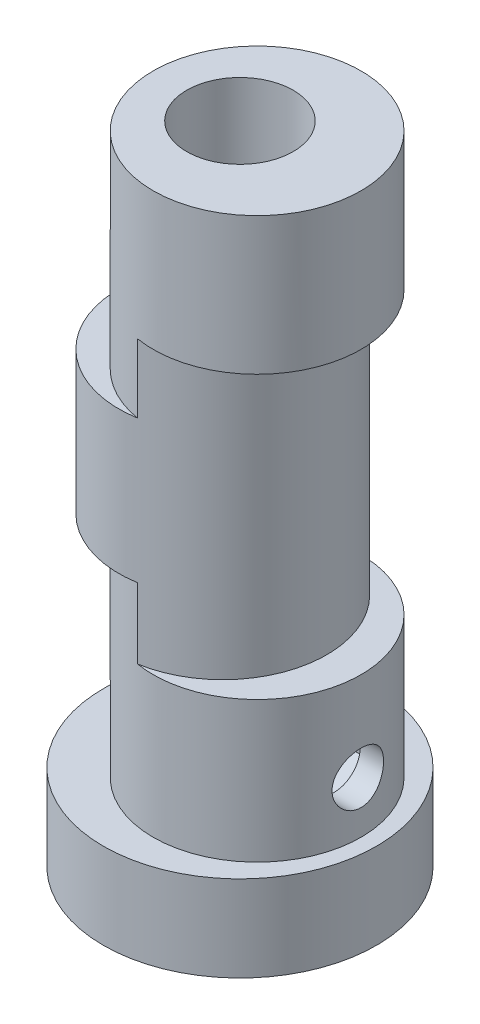
ISO-10303-21;
HEADER;
FILE_DESCRIPTION(('STEP AP214'),'2;1');
FILE_NAME('part.step','',(''),(''),'','','');
FILE_SCHEMA(('AUTOMOTIVE_DESIGN { 1 0 10303 214 1 1 1 1 }'));
ENDSEC;
DATA;
#1=APPLICATION_CONTEXT('core data for automotive mechanical design processes');
#2=APPLICATION_PROTOCOL_DEFINITION('international standard','automotive_design',2000,#1);
#3=PRODUCT_CONTEXT('',#1,'mechanical');
#4=PRODUCT('Part','Part','',(#3));
#5=PRODUCT_RELATED_PRODUCT_CATEGORY('part','',(#4));
#6=PRODUCT_DEFINITION_FORMATION('','',#4);
#7=PRODUCT_DEFINITION_CONTEXT('part definition',#1,'design');
#8=PRODUCT_DEFINITION('design','',#6,#7);
#9=PRODUCT_DEFINITION_SHAPE('','',#8);
#10=(LENGTH_UNIT() NAMED_UNIT(*) SI_UNIT(.MILLI.,.METRE.));
#11=(NAMED_UNIT(*) PLANE_ANGLE_UNIT() SI_UNIT($,.RADIAN.));
#12=(NAMED_UNIT(*) SI_UNIT($,.STERADIAN.) SOLID_ANGLE_UNIT());
#13=UNCERTAINTY_MEASURE_WITH_UNIT(LENGTH_MEASURE(1.E-05),#10,'distance_accuracy_value','');
#14=(GEOMETRIC_REPRESENTATION_CONTEXT(3) GLOBAL_UNCERTAINTY_ASSIGNED_CONTEXT((#13)) GLOBAL_UNIT_ASSIGNED_CONTEXT((#10,
#11,#12)) REPRESENTATION_CONTEXT('',''));
#15=CARTESIAN_POINT('',(0.,0.,0.));
#16=DIRECTION('',(0.,0.,1.));
#17=DIRECTION('',(1.,0.,0.));
#18=AXIS2_PLACEMENT_3D('',#15,#16,#17);
#19=CARTESIAN_POINT('',(0.,37.6,0.));
#20=DIRECTION('',(0.,-1.,0.));
#21=DIRECTION('',(0.,0.,-1.));
#22=AXIS2_PLACEMENT_3D('',#19,#20,#21);
#23=CYLINDRICAL_SURFACE('',#22,3.1);
#24=CARTESIAN_POINT('',(0.,0.,0.));
#25=DIRECTION('',(0.,-1.,0.));
#26=DIRECTION('',(0.,0.,-1.));
#27=AXIS2_PLACEMENT_3D('',#24,#25,#26);
#28=CIRCLE('',#27,3.1);
#29=CARTESIAN_POINT('',(0.,0.,-3.1));
#30=VERTEX_POINT('',#29);
#31=EDGE_CURVE('E141',#30,#30,#28,.T.);
#32=ORIENTED_EDGE('',*,*,#31,.T.);
#33=EDGE_LOOP('',(#32));
#34=FACE_BOUND('',#33,.T.);
#35=CARTESIAN_POINT('',(0.,37.6,0.));
#36=DIRECTION('',(0.,-1.,0.));
#37=DIRECTION('',(0.,0.,-1.));
#38=AXIS2_PLACEMENT_3D('',#35,#36,#37);
#39=CIRCLE('',#38,3.1);
#40=CARTESIAN_POINT('',(0.,37.6,-3.1));
#41=VERTEX_POINT('',#40);
#42=EDGE_CURVE('E152',#41,#41,#39,.T.);
#43=ORIENTED_EDGE('',*,*,#42,.F.);
#44=EDGE_LOOP('',(#43));
#45=FACE_BOUND('',#44,.T.);
#46=CARTESIAN_POINT('',(0.,11.1754264805429,0.));
#47=DIRECTION('',(0.,-0.866025403784439,0.5));
#48=DIRECTION('',(0.,-0.5,-0.866025403784439));
#49=AXIS2_PLACEMENT_3D('',#46,#47,#48);
#50=ELLIPSE('',#49,3.57957166897568,3.1);
#51=CARTESIAN_POINT('',(3.1,11.1754264805429,0.));
#52=VERTEX_POINT('',#51);
#53=CARTESIAN_POINT('',(1.43090880212542,9.58771324027147,-2.75));
#54=VERTEX_POINT('',#53);
#55=EDGE_CURVE('E11',#52,#54,#50,.F.);
#56=ORIENTED_EDGE('',*,*,#55,.F.);
#57=CARTESIAN_POINT('',(0.,11.1754264805429,0.));
#58=DIRECTION('',(0.,-0.866025403784438,-0.5));
#59=DIRECTION('',(0.,-0.5,0.866025403784439));
#60=AXIS2_PLACEMENT_3D('',#57,#58,#59);
#61=ELLIPSE('',#60,3.57957166897568,3.1);
#62=CARTESIAN_POINT('',(1.43090880212543,9.58771324027147,2.75));
#63=VERTEX_POINT('',#62);
#64=EDGE_CURVE('E47',#63,#52,#61,.F.);
#65=ORIENTED_EDGE('',*,*,#64,.F.);
#66=DIRECTION('',(0.,-1.,0.));
#67=VECTOR('',#66,1.);
#68=CARTESIAN_POINT('',(1.43090880212543,37.6,2.75));
#69=LINE('',#68,#67);
#70=CARTESIAN_POINT('',(1.43090880212542,6.41228675972853,2.75));
#71=VERTEX_POINT('',#70);
#72=EDGE_CURVE('E233',#71,#63,#69,.F.);
#73=ORIENTED_EDGE('',*,*,#72,.F.);
#74=CARTESIAN_POINT('',(0.,4.82457351945705,0.));
#75=DIRECTION('',(0.,0.866025403784438,-0.5));
#76=DIRECTION('',(0.,-0.5,-0.866025403784439));
#77=AXIS2_PLACEMENT_3D('',#74,#75,#76);
#78=ELLIPSE('',#77,3.57957166897568,3.1);
#79=CARTESIAN_POINT('',(3.1,4.82457351945706,0.));
#80=VERTEX_POINT('',#79);
#81=EDGE_CURVE('E231',#80,#71,#78,.F.);
#82=ORIENTED_EDGE('',*,*,#81,.F.);
#83=CARTESIAN_POINT('',(0.,4.82457351945707,0.));
#84=DIRECTION('',(0.,0.866025403784438,0.500000000000001));
#85=DIRECTION('',(0.,-0.500000000000001,0.866025403784438));
#86=AXIS2_PLACEMENT_3D('',#83,#84,#85);
#87=ELLIPSE('',#86,3.57957166897568,3.1);
#88=CARTESIAN_POINT('',(1.43090880212542,6.41228675972853,-2.75));
#89=VERTEX_POINT('',#88);
#90=EDGE_CURVE('E229',#89,#80,#87,.F.);
#91=ORIENTED_EDGE('',*,*,#90,.F.);
#92=DIRECTION('',(0.,-1.,0.));
#93=VECTOR('',#92,1.);
#94=CARTESIAN_POINT('',(1.43090880212542,37.6,-2.75));
#95=LINE('',#94,#93);
#96=EDGE_CURVE('E225',#54,#89,#95,.T.);
#97=ORIENTED_EDGE('',*,*,#96,.F.);
#98=EDGE_LOOP('',(#56,#65,#73,#82,#91,#97));
#99=FACE_BOUND('',#98,.T.);
#100=ADVANCED_FACE('F39',(#34,#45,#99),#23,.F.);
#101=CARTESIAN_POINT('',(1.,13.2,0.));
#102=DIRECTION('',(0.,-1.,0.));
#103=DIRECTION('',(0.,0.,-1.));
#104=AXIS2_PLACEMENT_3D('',#101,#102,#103);
#105=CYLINDRICAL_SURFACE('',#104,6.05);
#106=CARTESIAN_POINT('',(1.,13.2,0.));
#107=DIRECTION('',(0.,1.,0.));
#108=DIRECTION('',(0.,0.,1.));
#109=AXIS2_PLACEMENT_3D('',#106,#107,#108);
#110=CIRCLE('',#109,6.05);
#111=CARTESIAN_POINT('',(0.,13.2,5.96678305286861));
#112=VERTEX_POINT('',#111);
#113=CARTESIAN_POINT('',(0.,13.2,-5.96678305286861));
#114=VERTEX_POINT('',#113);
#115=EDGE_CURVE('E204',#112,#114,#110,.T.);
#116=ORIENTED_EDGE('',*,*,#115,.F.);
#117=DIRECTION('',(0.,-1.,0.));
#118=VECTOR('',#117,1.);
#119=CARTESIAN_POINT('',(0.,17.3,5.96678305286861));
#120=LINE('',#119,#118);
#121=CARTESIAN_POINT('',(0.,17.3,5.96678305286861));
#122=VERTEX_POINT('',#121);
#123=EDGE_CURVE('E212',#122,#112,#120,.T.);
#124=ORIENTED_EDGE('',*,*,#123,.F.);
#125=CARTESIAN_POINT('',(1.,17.3,0.));
#126=DIRECTION('',(0.,1.,0.));
#127=DIRECTION('',(0.,0.,-1.));
#128=AXIS2_PLACEMENT_3D('',#125,#126,#127);
#129=CIRCLE('',#128,6.05);
#130=CARTESIAN_POINT('',(0.,17.3,-5.96678305286861));
#131=VERTEX_POINT('',#130);
#132=EDGE_CURVE('E60',#131,#122,#129,.T.);
#133=ORIENTED_EDGE('',*,*,#132,.F.);
#134=DIRECTION('',(0.,-1.,0.));
#135=VECTOR('',#134,1.);
#136=CARTESIAN_POINT('',(0.,17.3,-5.96678305286861));
#137=LINE('',#136,#135);
#138=EDGE_CURVE('E208',#131,#114,#137,.T.);
#139=ORIENTED_EDGE('',*,*,#138,.T.);
#140=EDGE_LOOP('',(#116,#124,#133,#139));
#141=FACE_BOUND('',#140,.T.);
#142=CARTESIAN_POINT('',(1.,5.,0.));
#143=DIRECTION('',(0.,1.,0.));
#144=DIRECTION('',(0.,0.,1.));
#145=AXIS2_PLACEMENT_3D('',#142,#143,#144);
#146=CIRCLE('',#145,6.05);
#147=CARTESIAN_POINT('',(1.,5.,6.05));
#148=VERTEX_POINT('',#147);
#149=EDGE_CURVE('E222',#148,#148,#146,.T.);
#150=ORIENTED_EDGE('',*,*,#149,.T.);
#151=EDGE_LOOP('',(#150));
#152=FACE_BOUND('',#151,.T.);
#153=CARTESIAN_POINT('',(6.86110057924278,8.,1.5));
#154=CARTESIAN_POINT('',(6.86110217367536,7.91714587137172,1.49999760729791));
#155=CARTESIAN_POINT('',(6.86287663428657,7.83426511613971,1.49311181217705));
#156=CARTESIAN_POINT('',(6.86976498249834,7.670882052661,1.46579350632765));
#157=CARTESIAN_POINT('',(6.87488084608938,7.59038118125792,1.445352979689));
#158=CARTESIAN_POINT('',(6.88783778656131,7.43414476654856,1.39162611516137));
#159=CARTESIAN_POINT('',(6.8956753813872,7.35840327982597,1.35835618463151));
#160=CARTESIAN_POINT('',(6.91318836160376,7.21356909431857,1.27996470184059));
#161=CARTESIAN_POINT('',(6.92286381710868,7.14447664934581,1.23484269739853));
#162=CARTESIAN_POINT('',(6.94319677296986,7.01340615943171,1.13298474675015));
#163=CARTESIAN_POINT('',(6.95386975225715,6.95159324991117,1.07603935351548));
#164=CARTESIAN_POINT('',(6.97486081852894,6.83829068297635,0.952602302875023));
#165=CARTESIAN_POINT('',(6.98517887267731,6.78680197859623,0.886109765137409));
#166=CARTESIAN_POINT('',(7.00446859697605,6.69493532862109,0.744336271648474));
#167=CARTESIAN_POINT('',(7.01341987085189,6.65471937361786,0.668947333761871));
#168=CARTESIAN_POINT('',(7.02879099894912,6.58759271270261,0.512220466156249));
#169=CARTESIAN_POINT('',(7.03521122030227,6.56068007698666,0.430883401249684));
#170=CARTESIAN_POINT('',(7.04468743585777,6.52145227668836,0.266290396119425));
#171=CARTESIAN_POINT('',(7.04780795818022,6.50885674721242,0.183105055079771));
#172=CARTESIAN_POINT('',(7.0505579516296,6.49774089309785,0.0157474370432213));
#173=CARTESIAN_POINT('',(7.05018793073681,6.49921852038692,-0.0684246945649362));
#174=CARTESIAN_POINT('',(7.04604665321057,6.51600488970314,-0.233422888586485));
#175=CARTESIAN_POINT('',(7.04234981165999,6.53101103591603,-0.314281884537095));
#176=CARTESIAN_POINT('',(7.0320567873074,6.57394238136332,-0.472296327731109));
#177=CARTESIAN_POINT('',(7.02546045160435,6.60186826190719,-0.549451579424341));
#178=CARTESIAN_POINT('',(7.00999536208592,6.67009276335159,-0.698668567709344));
#179=CARTESIAN_POINT('',(7.00110685770729,6.71049955711579,-0.770678714844493));
#180=CARTESIAN_POINT('',(6.98202234290113,6.80245692985698,-0.907002591352019));
#181=CARTESIAN_POINT('',(6.97182610847385,6.85400941900861,-0.971314998529292));
#182=CARTESIAN_POINT('',(6.95091759023657,6.96841873937155,-1.09222215921076));
#183=CARTESIAN_POINT('',(6.94019879471365,7.03154003122689,-1.14856580377562));
#184=CARTESIAN_POINT('',(6.91970208093319,7.16644754447298,-1.24992355886011));
#185=CARTESIAN_POINT('',(6.90992420519092,7.23823415707433,-1.29493715758235));
#186=CARTESIAN_POINT('',(6.89239348689465,7.38892100880766,-1.37251428556563));
#187=CARTESIAN_POINT('',(6.88465038180007,7.46785310780654,-1.4050182819803));
#188=CARTESIAN_POINT('',(6.87219140120225,7.63029951371645,-1.45621769350445));
#189=CARTESIAN_POINT('',(6.86747488999598,7.71381285438491,-1.47491600847108));
#190=CARTESIAN_POINT('',(6.86173629027501,7.88072474513991,-1.49755857016642));
#191=CARTESIAN_POINT('',(6.86062135564323,7.96406984990241,-1.50187370065171));
#192=CARTESIAN_POINT('',(6.86195957531532,8.13028931028266,-1.49664199033746));
#193=CARTESIAN_POINT('',(6.86441240716819,8.21316370776287,-1.48709640225529));
#194=CARTESIAN_POINT('',(6.87252090694453,8.3747181302517,-1.45473918826511));
#195=CARTESIAN_POINT('',(6.87812460220794,8.45344409600041,-1.43214267357483));
#196=CARTESIAN_POINT('',(6.89185426126893,8.6059908666113,-1.37456314650524));
#197=CARTESIAN_POINT('',(6.89998052003537,8.67981109660887,-1.33957868550896));
#198=CARTESIAN_POINT('',(6.9180357563623,8.8220247131691,-1.25743723368045));
#199=CARTESIAN_POINT('',(6.92799654258515,8.89028562447971,-1.21005803083144));
#200=CARTESIAN_POINT('',(6.94852006867982,9.01802431333303,-1.10475366386703));
#201=CARTESIAN_POINT('',(6.95908290558408,9.07750066949077,-1.04682679646502));
#202=CARTESIAN_POINT('',(6.97993443343643,9.18747991415488,-0.920370957671625));
#203=CARTESIAN_POINT('',(6.99021001670874,9.23772649030761,-0.851616508272099));
#204=CARTESIAN_POINT('',(7.00906038437325,9.32596033846671,-0.706430295944581));
#205=CARTESIAN_POINT('',(7.01763525706996,9.36394824703339,-0.629998931928885));
#206=CARTESIAN_POINT('',(7.03206425372718,9.42625932271639,-0.472154470432044));
#207=CARTESIAN_POINT('',(7.03793777127095,9.45068016287485,-0.39078178696266));
#208=CARTESIAN_POINT('',(7.04638710617045,9.48545807315556,-0.224922898812481));
#209=CARTESIAN_POINT('',(7.04896354877285,9.49581780980274,-0.14043728758455));
#210=CARTESIAN_POINT('',(7.05050340142597,9.50203151440792,0.0268395993869947));
#211=CARTESIAN_POINT('',(7.0495611020357,9.49826403330175,0.109616160271725));
#212=CARTESIAN_POINT('',(7.04437794752261,9.47719588648497,0.273317601317939));
#213=CARTESIAN_POINT('',(7.04013718756209,9.45989561120246,0.354242534830506));
#214=CARTESIAN_POINT('',(7.02884767516888,9.41245458975646,0.511554490385019));
#215=CARTESIAN_POINT('',(7.02181368205091,9.3823812785264,0.587962977172823));
#216=CARTESIAN_POINT('',(7.00567908247639,9.31030923435466,0.734692610041684));
#217=CARTESIAN_POINT('',(6.99657821932499,9.26830901998936,0.805012998512026));
#218=CARTESIAN_POINT('',(6.97702334081307,9.17241531369771,0.93936896622043));
#219=CARTESIAN_POINT('',(6.96654243871359,9.11826430572933,1.00321683816191));
#220=CARTESIAN_POINT('',(6.94553123285239,9.0001075108588,1.1210479399132));
#221=CARTESIAN_POINT('',(6.9350009172867,8.93609923946367,1.17502867521914));
#222=CARTESIAN_POINT('',(6.91486446643399,8.79863730685887,1.27256022779907));
#223=CARTESIAN_POINT('',(6.90527872854423,8.72503245648526,1.31590249407604));
#224=CARTESIAN_POINT('',(6.8883898493467,8.57135425832718,1.38953305297952));
#225=CARTESIAN_POINT('',(6.88108502882819,8.49128572402066,1.41983095511834));
#226=CARTESIAN_POINT('',(6.87074164327452,8.34278419005039,1.46193818009331));
#227=CARTESIAN_POINT('',(6.8671532176125,8.27506913437123,1.47618052311146));
#228=CARTESIAN_POINT('',(6.86233211731693,8.13824215433896,1.49521204246427));
#229=CARTESIAN_POINT('',(6.86109924890864,8.06913034535939,1.50000199637996));
#230=CARTESIAN_POINT('',(6.86110057924278,8.,1.5));
#231=B_SPLINE_CURVE_WITH_KNOTS('',3,(#153,#154,#155,#156,#157,#158,#159,#160,#161,#162,#163,
#164,#165,#166,#167,#168,#169,#170,#171,#172,#173,#174,#175,#176,#177,#178,#179,#180,#181,#182,
#183,#184,#185,#186,#187,#188,#189,#190,#191,#192,#193,#194,#195,#196,#197,#198,#199,#200,#201,
#202,#203,#204,#205,#206,#207,#208,#209,#210,#211,#212,#213,#214,#215,#216,#217,#218,#219,#220,
#221,#222,#223,#224,#225,#226,#227,#228,#229,#230),.UNSPECIFIED.,.T.,.F.,(4,2,2,2,2,2,2,2,2,2,2,
2,2,2,2,2,2,2,2,2,2,2,2,2,2,2,2,2,2,2,2,2,2,2,2,2,2,2,4),(0.,0.248308555378158,
0.496764084985492,0.744902916216995,0.993051215830473,1.24604175182045,1.49905563079248,
1.7555380079994,2.01198316847503,2.2633149664209,2.51461018850564,2.76042038788378,
3.0062435512986,3.25426007800209,3.5023191440844,3.75698358308596,4.01165952364873,
4.26753289950162,4.52335251433644,4.77252234046925,5.02166964829331,5.26682305522691,
5.51200513928917,5.76192634197362,6.01188793896216,6.26798960627748,6.52407797276705,
6.77829797232379,7.0324697552718,7.27988006564556,7.52728323836719,7.77339617740614,
8.01953969916322,8.27149784954299,8.52351960945305,8.78014536003377,9.03658173491864,
9.24377802972128,9.45095727924299),.UNSPECIFIED.);
#232=CARTESIAN_POINT('',(6.86110057924278,8.,1.5));
#233=VERTEX_POINT('',#232);
#234=EDGE_CURVE('E137',#233,#233,#231,.T.);
#235=ORIENTED_EDGE('',*,*,#234,.F.);
#236=EDGE_LOOP('',(#235));
#237=FACE_BOUND('',#236,.T.);
#238=ADVANCED_FACE('F154',(#141,#152,#237),#105,.T.);
#239=CARTESIAN_POINT('',(0.,5.,0.));
#240=DIRECTION('',(0.,-1.,0.));
#241=DIRECTION('',(0.,0.,-1.));
#242=AXIS2_PLACEMENT_3D('',#239,#240,#241);
#243=CYLINDRICAL_SURFACE('',#242,7.95);
#244=CARTESIAN_POINT('',(0.,5.,0.));
#245=DIRECTION('',(0.,1.,0.));
#246=DIRECTION('',(0.,0.,1.));
#247=AXIS2_PLACEMENT_3D('',#244,#245,#246);
#248=CIRCLE('',#247,7.95);
#249=CARTESIAN_POINT('',(0.,5.,7.95));
#250=VERTEX_POINT('',#249);
#251=EDGE_CURVE('E217',#250,#250,#248,.T.);
#252=ORIENTED_EDGE('',*,*,#251,.F.);
#253=EDGE_LOOP('',(#252));
#254=FACE_BOUND('',#253,.T.);
#255=CARTESIAN_POINT('',(0.,0.,0.));
#256=DIRECTION('',(0.,1.,0.));
#257=DIRECTION('',(0.,0.,1.));
#258=AXIS2_PLACEMENT_3D('',#255,#256,#257);
#259=CIRCLE('',#258,7.95);
#260=CARTESIAN_POINT('',(0.,0.,7.95));
#261=VERTEX_POINT('',#260);
#262=EDGE_CURVE('E214',#261,#261,#259,.T.);
#263=ORIENTED_EDGE('',*,*,#262,.T.);
#264=EDGE_LOOP('',(#263));
#265=FACE_BOUND('',#264,.T.);
#266=ADVANCED_FACE('F41',(#254,#265),#243,.T.);
#267=CARTESIAN_POINT('',(0.,5.,0.));
#268=DIRECTION('',(0.,1.,0.));
#269=DIRECTION('',(0.,0.,1.));
#270=AXIS2_PLACEMENT_3D('',#267,#268,#269);
#271=PLANE('',#270);
#272=ORIENTED_EDGE('',*,*,#149,.F.);
#273=EDGE_LOOP('',(#272));
#274=FACE_BOUND('',#273,.T.);
#275=ORIENTED_EDGE('',*,*,#251,.T.);
#276=EDGE_LOOP('',(#275));
#277=FACE_BOUND('',#276,.T.);
#278=ADVANCED_FACE('F197',(#274,#277),#271,.T.);
#279=CARTESIAN_POINT('',(0.,0.,0.));
#280=DIRECTION('',(0.,1.,0.));
#281=DIRECTION('',(0.,0.,1.));
#282=AXIS2_PLACEMENT_3D('',#279,#280,#281);
#283=PLANE('',#282);
#284=ORIENTED_EDGE('',*,*,#31,.F.);
#285=EDGE_LOOP('',(#284));
#286=FACE_BOUND('',#285,.T.);
#287=ORIENTED_EDGE('',*,*,#262,.F.);
#288=EDGE_LOOP('',(#287));
#289=FACE_BOUND('',#288,.T.);
#290=ADVANCED_FACE('F192',(#286,#289),#283,.F.);
#291=CARTESIAN_POINT('',(1.,13.2,0.));
#292=DIRECTION('',(0.,1.,0.));
#293=DIRECTION('',(0.,0.,1.));
#294=AXIS2_PLACEMENT_3D('',#291,#292,#293);
#295=PLANE('',#294);
#296=CARTESIAN_POINT('',(-1.,13.2,0.));
#297=DIRECTION('',(0.,1.,0.));
#298=DIRECTION('',(0.,0.,1.));
#299=AXIS2_PLACEMENT_3D('',#296,#297,#298);
#300=CIRCLE('',#299,6.05);
#301=EDGE_CURVE('E202',#112,#114,#300,.T.);
#302=ORIENTED_EDGE('',*,*,#301,.F.);
#303=ORIENTED_EDGE('',*,*,#115,.T.);
#304=EDGE_LOOP('',(#302,#303));
#305=FACE_BOUND('',#304,.T.);
#306=ADVANCED_FACE('F189',(#305),#295,.T.);
#307=CARTESIAN_POINT('',(-1.,29.6,0.));
#308=DIRECTION('',(0.,-1.,0.));
#309=DIRECTION('',(0.,0.,-1.));
#310=AXIS2_PLACEMENT_3D('',#307,#308,#309);
#311=CYLINDRICAL_SURFACE('',#310,6.05);
#312=CARTESIAN_POINT('',(-1.,29.6,0.));
#313=DIRECTION('',(0.,1.,0.));
#314=DIRECTION('',(0.,0.,1.));
#315=AXIS2_PLACEMENT_3D('',#312,#313,#314);
#316=CIRCLE('',#315,6.05);
#317=CARTESIAN_POINT('',(0.,29.6,5.96678305286861));
#318=VERTEX_POINT('',#317);
#319=CARTESIAN_POINT('',(0.,29.6,-5.96678305286861));
#320=VERTEX_POINT('',#319);
#321=EDGE_CURVE('E207',#318,#320,#316,.T.);
#322=ORIENTED_EDGE('',*,*,#321,.F.);
#323=DIRECTION('',(0.,1.,0.));
#324=VECTOR('',#323,1.);
#325=CARTESIAN_POINT('',(0.,25.6,5.9667830528686));
#326=LINE('',#325,#324);
#327=CARTESIAN_POINT('',(0.,25.6,5.9667830528686));
#328=VERTEX_POINT('',#327);
#329=EDGE_CURVE('E437',#328,#318,#326,.T.);
#330=ORIENTED_EDGE('',*,*,#329,.F.);
#331=CARTESIAN_POINT('',(-1.,25.6,0.));
#332=DIRECTION('',(0.,1.,0.));
#333=DIRECTION('',(0.,0.,1.));
#334=AXIS2_PLACEMENT_3D('',#331,#332,#333);
#335=CIRCLE('',#334,6.05);
#336=CARTESIAN_POINT('',(0.,25.6,-5.96678305286861));
#337=VERTEX_POINT('',#336);
#338=EDGE_CURVE('E443',#337,#328,#335,.T.);
#339=ORIENTED_EDGE('',*,*,#338,.F.);
#340=DIRECTION('',(0.,1.,0.));
#341=VECTOR('',#340,1.);
#342=CARTESIAN_POINT('',(0.,25.6,-5.96678305286861));
#343=LINE('',#342,#341);
#344=EDGE_CURVE('E434',#337,#320,#343,.T.);
#345=ORIENTED_EDGE('',*,*,#344,.T.);
#346=EDGE_LOOP('',(#322,#330,#339,#345));
#347=FACE_BOUND('',#346,.T.);
#348=CARTESIAN_POINT('',(-1.,17.3,0.));
#349=DIRECTION('',(0.,-1.,0.));
#350=DIRECTION('',(0.,0.,-1.));
#351=AXIS2_PLACEMENT_3D('',#348,#349,#350);
#352=CIRCLE('',#351,6.05);
#353=EDGE_CURVE('E426',#122,#131,#352,.T.);
#354=ORIENTED_EDGE('',*,*,#353,.F.);
#355=ORIENTED_EDGE('',*,*,#123,.T.);
#356=ORIENTED_EDGE('',*,*,#301,.T.);
#357=ORIENTED_EDGE('',*,*,#138,.F.);
#358=EDGE_LOOP('',(#354,#355,#356,#357));
#359=FACE_BOUND('',#358,.T.);
#360=ADVANCED_FACE('F187',(#347,#359),#311,.T.);
#361=CARTESIAN_POINT('',(0.,17.3,0.));
#362=DIRECTION('',(0.,-1.,0.));
#363=DIRECTION('',(0.,0.,-1.));
#364=AXIS2_PLACEMENT_3D('',#361,#362,#363);
#365=PLANE('',#364);
#366=ORIENTED_EDGE('',*,*,#132,.T.);
#367=ORIENTED_EDGE('',*,*,#353,.T.);
#368=EDGE_LOOP('',(#366,#367));
#369=FACE_BOUND('',#368,.T.);
#370=ADVANCED_FACE('F180',(#369),#365,.T.);
#371=CARTESIAN_POINT('',(0.,29.6,0.));
#372=DIRECTION('',(0.,1.,0.));
#373=DIRECTION('',(0.,0.,1.));
#374=AXIS2_PLACEMENT_3D('',#371,#372,#373);
#375=PLANE('',#374);
#376=CARTESIAN_POINT('',(1.,29.6,0.));
#377=DIRECTION('',(0.,1.,0.));
#378=DIRECTION('',(0.,0.,1.));
#379=AXIS2_PLACEMENT_3D('',#376,#377,#378);
#380=CIRCLE('',#379,6.05);
#381=EDGE_CURVE('E431',#318,#320,#380,.T.);
#382=ORIENTED_EDGE('',*,*,#381,.F.);
#383=ORIENTED_EDGE('',*,*,#321,.T.);
#384=EDGE_LOOP('',(#382,#383));
#385=FACE_BOUND('',#384,.T.);
#386=ADVANCED_FACE('F177',(#385),#375,.F.);
#387=CARTESIAN_POINT('',(1.,37.6,0.));
#388=DIRECTION('',(0.,-1.,0.));
#389=DIRECTION('',(0.,0.,-1.));
#390=AXIS2_PLACEMENT_3D('',#387,#388,#389);
#391=CYLINDRICAL_SURFACE('',#390,6.05);
#392=CARTESIAN_POINT('',(1.,37.6,0.));
#393=DIRECTION('',(0.,1.,0.));
#394=DIRECTION('',(0.,0.,1.));
#395=AXIS2_PLACEMENT_3D('',#392,#393,#394);
#396=CIRCLE('',#395,6.05);
#397=CARTESIAN_POINT('',(1.,37.6,6.05));
#398=VERTEX_POINT('',#397);
#399=EDGE_CURVE('E430',#398,#398,#396,.T.);
#400=ORIENTED_EDGE('',*,*,#399,.F.);
#401=EDGE_LOOP('',(#400));
#402=FACE_BOUND('',#401,.T.);
#403=ORIENTED_EDGE('',*,*,#381,.T.);
#404=ORIENTED_EDGE('',*,*,#344,.F.);
#405=CARTESIAN_POINT('',(1.,25.6,0.));
#406=DIRECTION('',(0.,-1.,0.));
#407=DIRECTION('',(0.,0.,1.));
#408=AXIS2_PLACEMENT_3D('',#405,#406,#407);
#409=CIRCLE('',#408,6.05);
#410=EDGE_CURVE('E439',#328,#337,#409,.T.);
#411=ORIENTED_EDGE('',*,*,#410,.F.);
#412=ORIENTED_EDGE('',*,*,#329,.T.);
#413=EDGE_LOOP('',(#403,#404,#411,#412));
#414=FACE_BOUND('',#413,.T.);
#415=ADVANCED_FACE('F175',(#402,#414),#391,.T.);
#416=CARTESIAN_POINT('',(0.,37.6,0.));
#417=DIRECTION('',(0.,1.,0.));
#418=DIRECTION('',(0.,0.,1.));
#419=AXIS2_PLACEMENT_3D('',#416,#417,#418);
#420=PLANE('',#419);
#421=ORIENTED_EDGE('',*,*,#42,.T.);
#422=EDGE_LOOP('',(#421));
#423=FACE_BOUND('',#422,.T.);
#424=ORIENTED_EDGE('',*,*,#399,.T.);
#425=EDGE_LOOP('',(#424));
#426=FACE_BOUND('',#425,.T.);
#427=ADVANCED_FACE('F171',(#423,#426),#420,.T.);
#428=CARTESIAN_POINT('',(0.,25.6,0.));
#429=DIRECTION('',(0.,1.,0.));
#430=DIRECTION('',(0.,0.,1.));
#431=AXIS2_PLACEMENT_3D('',#428,#429,#430);
#432=PLANE('',#431);
#433=ORIENTED_EDGE('',*,*,#338,.T.);
#434=ORIENTED_EDGE('',*,*,#410,.T.);
#435=EDGE_LOOP('',(#433,#434));
#436=FACE_BOUND('',#435,.T.);
#437=ADVANCED_FACE('F163',(#436),#432,.T.);
#438=CARTESIAN_POINT('',(7.95,8.,0.));
#439=DIRECTION('',(-1.,0.,0.));
#440=DIRECTION('',(0.,0.,1.));
#441=AXIS2_PLACEMENT_3D('',#438,#439,#440);
#442=CYLINDRICAL_SURFACE('',#441,1.5);
#443=CARTESIAN_POINT('',(5.5,8.,0.));
#444=DIRECTION('',(1.,0.,0.));
#445=DIRECTION('',(0.,0.,-1.));
#446=AXIS2_PLACEMENT_3D('',#443,#444,#445);
#447=CIRCLE('',#446,1.5);
#448=CARTESIAN_POINT('',(5.5,8.,-1.5));
#449=VERTEX_POINT('',#448);
#450=EDGE_CURVE('E133',#449,#449,#447,.T.);
#451=ORIENTED_EDGE('',*,*,#450,.F.);
#452=EDGE_LOOP('',(#451));
#453=FACE_BOUND('',#452,.T.);
#454=ORIENTED_EDGE('',*,*,#234,.T.);
#455=EDGE_LOOP('',(#454));
#456=FACE_BOUND('',#455,.T.);
#457=ADVANCED_FACE('F158',(#453,#456),#442,.F.);
#458=CARTESIAN_POINT('',(5.5,9.58771324027147,-2.75));
#459=DIRECTION('',(0.,-0.866025403784439,0.5));
#460=DIRECTION('',(0.,-0.5,-0.866025403784439));
#461=AXIS2_PLACEMENT_3D('',#458,#459,#460);
#462=PLANE('',#461);
#463=ORIENTED_EDGE('',*,*,#55,.T.);
#464=DIRECTION('',(-1.,0.,0.));
#465=VECTOR('',#464,1.);
#466=CARTESIAN_POINT('',(5.5,9.58771324027147,-2.75));
#467=LINE('',#466,#465);
#468=CARTESIAN_POINT('',(5.5,9.58771324027147,-2.75));
#469=VERTEX_POINT('',#468);
#470=EDGE_CURVE('E54',#469,#54,#467,.T.);
#471=ORIENTED_EDGE('',*,*,#470,.F.);
#472=DIRECTION('',(0.,0.5,0.866025403784438));
#473=VECTOR('',#472,1.);
#474=CARTESIAN_POINT('',(5.5,9.58771324027147,-2.75));
#475=LINE('',#474,#473);
#476=CARTESIAN_POINT('',(5.5,11.1754264805429,0.));
#477=VERTEX_POINT('',#476);
#478=EDGE_CURVE('E120',#469,#477,#475,.T.);
#479=ORIENTED_EDGE('',*,*,#478,.T.);
#480=DIRECTION('',(-1.,0.,0.));
#481=VECTOR('',#480,1.);
#482=CARTESIAN_POINT('',(5.5,11.1754264805429,0.));
#483=LINE('',#482,#481);
#484=EDGE_CURVE('E131',#477,#52,#483,.T.);
#485=ORIENTED_EDGE('',*,*,#484,.T.);
#486=EDGE_LOOP('',(#463,#471,#479,#485));
#487=FACE_BOUND('',#486,.T.);
#488=ADVANCED_FACE('F130',(#487),#462,.T.);
#489=CARTESIAN_POINT('',(5.5,11.1754264805429,0.));
#490=DIRECTION('',(0.,-0.866025403784438,-0.5));
#491=DIRECTION('',(0.,0.5,-0.866025403784439));
#492=AXIS2_PLACEMENT_3D('',#489,#490,#491);
#493=PLANE('',#492);
#494=ORIENTED_EDGE('',*,*,#64,.T.);
#495=ORIENTED_EDGE('',*,*,#484,.F.);
#496=DIRECTION('',(0.,-0.5,0.866025403784439));
#497=VECTOR('',#496,1.);
#498=CARTESIAN_POINT('',(5.5,11.1754264805429,0.));
#499=LINE('',#498,#497);
#500=CARTESIAN_POINT('',(5.5,9.58771324027147,2.75));
#501=VERTEX_POINT('',#500);
#502=EDGE_CURVE('E115',#477,#501,#499,.T.);
#503=ORIENTED_EDGE('',*,*,#502,.T.);
#504=DIRECTION('',(-1.,0.,0.));
#505=VECTOR('',#504,1.);
#506=CARTESIAN_POINT('',(5.5,9.58771324027147,2.75));
#507=LINE('',#506,#505);
#508=EDGE_CURVE('E138',#501,#63,#507,.T.);
#509=ORIENTED_EDGE('',*,*,#508,.T.);
#510=EDGE_LOOP('',(#494,#495,#503,#509));
#511=FACE_BOUND('',#510,.T.);
#512=ADVANCED_FACE('F135',(#511),#493,.T.);
#513=CARTESIAN_POINT('',(5.5,9.58771324027147,2.75));
#514=DIRECTION('',(0.,0.,-1.));
#515=DIRECTION('',(0.,1.,0.));
#516=AXIS2_PLACEMENT_3D('',#513,#514,#515);
#517=PLANE('',#516);
#518=ORIENTED_EDGE('',*,*,#72,.T.);
#519=ORIENTED_EDGE('',*,*,#508,.F.);
#520=DIRECTION('',(0.,-1.,0.));
#521=VECTOR('',#520,1.);
#522=CARTESIAN_POINT('',(5.5,9.58771324027147,2.75));
#523=LINE('',#522,#521);
#524=CARTESIAN_POINT('',(5.5,6.41228675972853,2.75));
#525=VERTEX_POINT('',#524);
#526=EDGE_CURVE('E122',#501,#525,#523,.T.);
#527=ORIENTED_EDGE('',*,*,#526,.T.);
#528=DIRECTION('',(-1.,0.,0.));
#529=VECTOR('',#528,1.);
#530=CARTESIAN_POINT('',(5.5,6.41228675972853,2.75));
#531=LINE('',#530,#529);
#532=EDGE_CURVE('E143',#525,#71,#531,.T.);
#533=ORIENTED_EDGE('',*,*,#532,.T.);
#534=EDGE_LOOP('',(#518,#519,#527,#533));
#535=FACE_BOUND('',#534,.T.);
#536=ADVANCED_FACE('F237',(#535),#517,.T.);
#537=CARTESIAN_POINT('',(5.5,6.41228675972853,2.75));
#538=DIRECTION('',(0.,0.866025403784438,-0.5));
#539=DIRECTION('',(0.,0.5,0.866025403784439));
#540=AXIS2_PLACEMENT_3D('',#537,#538,#539);
#541=PLANE('',#540);
#542=ORIENTED_EDGE('',*,*,#81,.T.);
#543=ORIENTED_EDGE('',*,*,#532,.F.);
#544=DIRECTION('',(0.,-0.5,-0.866025403784439));
#545=VECTOR('',#544,1.);
#546=CARTESIAN_POINT('',(5.5,6.41228675972853,2.75));
#547=LINE('',#546,#545);
#548=CARTESIAN_POINT('',(5.5,4.82457351945706,0.));
#549=VERTEX_POINT('',#548);
#550=EDGE_CURVE('E261',#525,#549,#547,.T.);
#551=ORIENTED_EDGE('',*,*,#550,.T.);
#552=DIRECTION('',(-1.,0.,0.));
#553=VECTOR('',#552,1.);
#554=CARTESIAN_POINT('',(5.5,4.82457351945706,0.));
#555=LINE('',#554,#553);
#556=EDGE_CURVE('E253',#549,#80,#555,.T.);
#557=ORIENTED_EDGE('',*,*,#556,.T.);
#558=EDGE_LOOP('',(#542,#543,#551,#557));
#559=FACE_BOUND('',#558,.T.);
#560=ADVANCED_FACE('F343',(#559),#541,.T.);
#561=CARTESIAN_POINT('',(5.5,4.82457351945706,0.));
#562=DIRECTION('',(0.,0.866025403784438,0.500000000000001));
#563=DIRECTION('',(0.,-0.500000000000001,0.866025403784438));
#564=AXIS2_PLACEMENT_3D('',#561,#562,#563);
#565=PLANE('',#564);
#566=ORIENTED_EDGE('',*,*,#90,.T.);
#567=ORIENTED_EDGE('',*,*,#556,.F.);
#568=DIRECTION('',(0.,0.5,-0.866025403784438));
#569=VECTOR('',#568,1.);
#570=CARTESIAN_POINT('',(5.5,4.82457351945706,0.));
#571=LINE('',#570,#569);
#572=CARTESIAN_POINT('',(5.5,6.41228675972853,-2.75));
#573=VERTEX_POINT('',#572);
#574=EDGE_CURVE('E252',#549,#573,#571,.T.);
#575=ORIENTED_EDGE('',*,*,#574,.T.);
#576=DIRECTION('',(-1.,0.,0.));
#577=VECTOR('',#576,1.);
#578=CARTESIAN_POINT('',(5.5,6.41228675972853,-2.75));
#579=LINE('',#578,#577);
#580=EDGE_CURVE('E246',#573,#89,#579,.T.);
#581=ORIENTED_EDGE('',*,*,#580,.T.);
#582=EDGE_LOOP('',(#566,#567,#575,#581));
#583=FACE_BOUND('',#582,.T.);
#584=ADVANCED_FACE('F248',(#583),#565,.T.);
#585=CARTESIAN_POINT('',(5.5,6.41228675972853,-2.75));
#586=DIRECTION('',(0.,0.,1.));
#587=DIRECTION('',(1.,0.,0.));
#588=AXIS2_PLACEMENT_3D('',#585,#586,#587);
#589=PLANE('',#588);
#590=ORIENTED_EDGE('',*,*,#96,.T.);
#591=ORIENTED_EDGE('',*,*,#580,.F.);
#592=DIRECTION('',(0.,1.,0.));
#593=VECTOR('',#592,1.);
#594=CARTESIAN_POINT('',(5.5,6.41228675972853,-2.75));
#595=LINE('',#594,#593);
#596=EDGE_CURVE('E256',#573,#469,#595,.T.);
#597=ORIENTED_EDGE('',*,*,#596,.T.);
#598=ORIENTED_EDGE('',*,*,#470,.T.);
#599=EDGE_LOOP('',(#590,#591,#597,#598));
#600=FACE_BOUND('',#599,.T.);
#601=ADVANCED_FACE('F245',(#600),#589,.T.);
#602=CARTESIAN_POINT('',(5.5,0.,0.));
#603=DIRECTION('',(1.,0.,0.));
#604=DIRECTION('',(0.,0.,-1.));
#605=AXIS2_PLACEMENT_3D('',#602,#603,#604);
#606=PLANE('',#605);
#607=ORIENTED_EDGE('',*,*,#478,.F.);
#608=ORIENTED_EDGE('',*,*,#596,.F.);
#609=ORIENTED_EDGE('',*,*,#574,.F.);
#610=ORIENTED_EDGE('',*,*,#550,.F.);
#611=ORIENTED_EDGE('',*,*,#526,.F.);
#612=ORIENTED_EDGE('',*,*,#502,.F.);
#613=EDGE_LOOP('',(#607,#608,#609,#610,#611,#612));
#614=FACE_BOUND('',#613,.T.);
#615=ORIENTED_EDGE('',*,*,#450,.T.);
#616=EDGE_LOOP('',(#615));
#617=FACE_BOUND('',#616,.T.);
#618=ADVANCED_FACE('F117',(#614,#617),#606,.F.);
#619=CLOSED_SHELL('',(#100,#238,#266,#278,#290,#306,#360,#370,#386,#415,#427,#437,#457,#488,
#512,#536,#560,#584,#601,#618));
#620=MANIFOLD_SOLID_BREP('B2',#619);
#621=ADVANCED_BREP_SHAPE_REPRESENTATION('',(#18,#620),#14);
#622=SHAPE_DEFINITION_REPRESENTATION(#9,#621);
ENDSEC;
END-ISO-10303-21;
